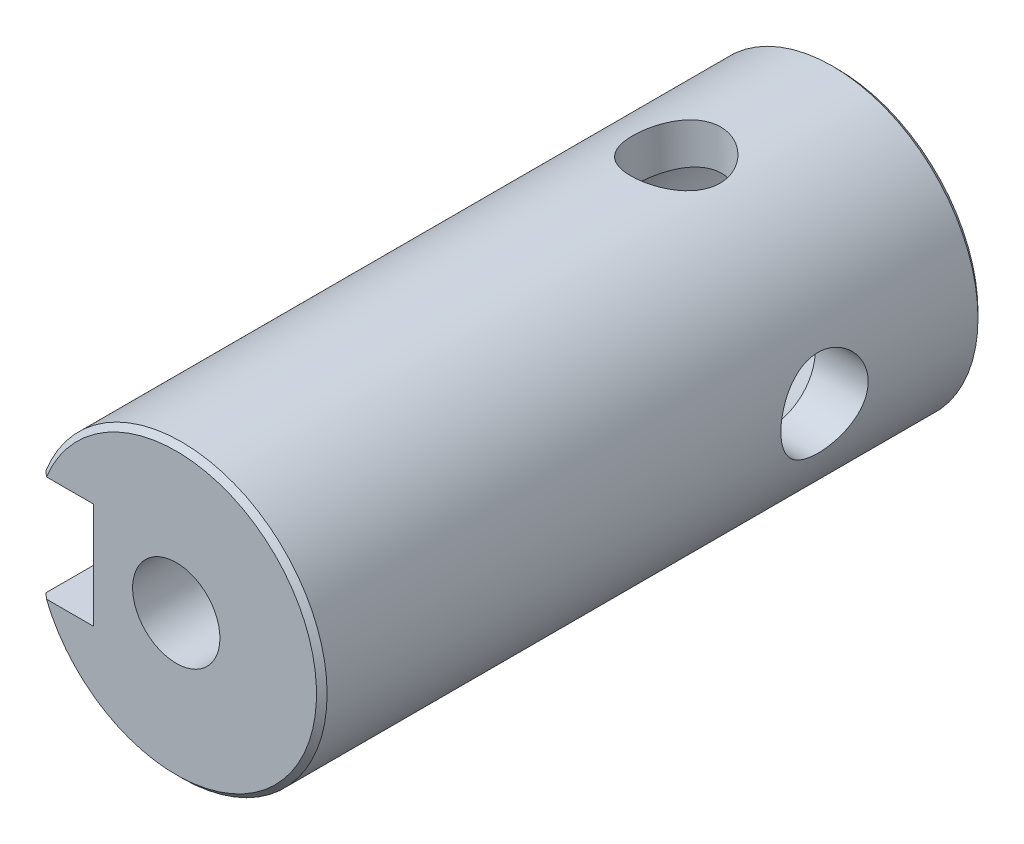
ISO-10303-21;
HEADER;
FILE_DESCRIPTION(('STEP AP214'),'2;1');
FILE_NAME('part.step','',(''),(''),'','','');
FILE_SCHEMA(('AUTOMOTIVE_DESIGN { 1 0 10303 214 1 1 1 1 }'));
ENDSEC;
DATA;
#1=APPLICATION_CONTEXT('core data for automotive mechanical design processes');
#2=APPLICATION_PROTOCOL_DEFINITION('international standard','automotive_design',2000,#1);
#3=PRODUCT_CONTEXT('',#1,'mechanical');
#4=PRODUCT('Part','Part','',(#3));
#5=PRODUCT_RELATED_PRODUCT_CATEGORY('part','',(#4));
#6=PRODUCT_DEFINITION_FORMATION('','',#4);
#7=PRODUCT_DEFINITION_CONTEXT('part definition',#1,'design');
#8=PRODUCT_DEFINITION('design','',#6,#7);
#9=PRODUCT_DEFINITION_SHAPE('','',#8);
#10=(LENGTH_UNIT() NAMED_UNIT(*) SI_UNIT(.MILLI.,.METRE.));
#11=(NAMED_UNIT(*) PLANE_ANGLE_UNIT() SI_UNIT($,.RADIAN.));
#12=(NAMED_UNIT(*) SI_UNIT($,.STERADIAN.) SOLID_ANGLE_UNIT());
#13=UNCERTAINTY_MEASURE_WITH_UNIT(LENGTH_MEASURE(1.E-05),#10,'distance_accuracy_value','');
#14=(GEOMETRIC_REPRESENTATION_CONTEXT(3) GLOBAL_UNCERTAINTY_ASSIGNED_CONTEXT((#13)) GLOBAL_UNIT_ASSIGNED_CONTEXT((#10,
#11,#12)) REPRESENTATION_CONTEXT('',''));
#15=CARTESIAN_POINT('',(0.,0.,0.));
#16=DIRECTION('',(0.,0.,1.));
#17=DIRECTION('',(1.,0.,0.));
#18=AXIS2_PLACEMENT_3D('',#15,#16,#17);
#19=CARTESIAN_POINT('',(0.,0.,18.));
#20=DIRECTION('',(0.,0.,-1.));
#21=DIRECTION('',(-1.,0.,0.));
#22=AXIS2_PLACEMENT_3D('',#19,#20,#21);
#23=CYLINDRICAL_SURFACE('',#22,5.5);
#24=CARTESIAN_POINT('',(0.,0.,0.200000000000009));
#25=DIRECTION('',(0.,0.,1.));
#26=DIRECTION('',(1.,0.,0.));
#27=AXIS2_PLACEMENT_3D('',#24,#25,#26);
#28=CIRCLE('',#27,5.5);
#29=CARTESIAN_POINT('',(5.5,0.,0.200000000000009));
#30=VERTEX_POINT('',#29);
#31=EDGE_CURVE('E46',#30,#30,#28,.T.);
#32=ORIENTED_EDGE('',*,*,#31,.T.);
#33=EDGE_LOOP('',(#32));
#34=FACE_BOUND('',#33,.T.);
#35=CARTESIAN_POINT('',(1.50153155011518,5.29106822900714,5.95280912227448));
#36=CARTESIAN_POINT('',(1.5015303981862,5.29106913211607,6.04322312501113));
#37=CARTESIAN_POINT('',(1.49401113626095,5.29321989611018,6.13364826883291));
#38=CARTESIAN_POINT('',(1.46421606809341,5.3015378549086,6.31185489682562));
#39=CARTESIAN_POINT('',(1.44193533127289,5.30770639170426,6.3996354874261));
#40=CARTESIAN_POINT('',(1.38345842765076,5.32324606494998,6.56994732337338));
#41=CARTESIAN_POINT('',(1.34728540528512,5.33261187190529,6.65248703487087));
#42=CARTESIAN_POINT('',(1.26215112112486,5.35339959233545,6.81039324966931));
#43=CARTESIAN_POINT('',(1.21318794491793,5.36482181353191,6.88575867682736));
#44=CARTESIAN_POINT('',(1.10223401079622,5.38872752084072,7.02956215190959));
#45=CARTESIAN_POINT('',(1.03990996759752,5.40123204592905,7.09773961001539));
#46=CARTESIAN_POINT('',(0.904757019184244,5.42550662780297,7.22291086872924));
#47=CARTESIAN_POINT('',(0.831926765739986,5.43727659004624,7.27990323176935));
#48=CARTESIAN_POINT('',(0.675998799726707,5.45887698226578,7.38221809209112));
#49=CARTESIAN_POINT('',(0.592719906020857,5.46866227020021,7.42727488916156));
#50=CARTESIAN_POINT('',(0.419434755560962,5.48467251645712,7.50269510722151));
#51=CARTESIAN_POINT('',(0.329429954530511,5.49089824268531,7.53306169711767));
#52=CARTESIAN_POINT('',(0.147999924659978,5.49873631768309,7.57737712347404));
#53=CARTESIAN_POINT('',(0.0566889822959188,5.50047554381514,7.59177076269244));
#54=CARTESIAN_POINT('',(-0.127017340836735,5.49929963229449,7.60513817938556));
#55=CARTESIAN_POINT('',(-0.219412489757571,5.49638547234987,7.60411519561664));
#56=CARTESIAN_POINT('',(-0.399548372267914,5.48618687771373,7.58697696687715));
#57=CARTESIAN_POINT('',(-0.487343624441412,5.47904458071596,7.57134340908362));
#58=CARTESIAN_POINT('',(-0.658893606341105,5.46107151611894,7.52621465268075));
#59=CARTESIAN_POINT('',(-0.742648079817531,5.45024051494716,7.49671857623754));
#60=CARTESIAN_POINT('',(-0.904898027978367,5.42567750963342,7.42437589651407));
#61=CARTESIAN_POINT('',(-0.983320888633931,5.41191318641183,7.38137779918648));
#62=CARTESIAN_POINT('',(-1.13193904345364,5.38279271160492,7.28337148460342));
#63=CARTESIAN_POINT('',(-1.20213237959169,5.367436182822,7.22836041801465));
#64=CARTESIAN_POINT('',(-1.33518482580393,5.33592910569586,7.10539159644772));
#65=CARTESIAN_POINT('',(-1.39765690545742,5.31977076870884,7.03701651134176));
#66=CARTESIAN_POINT('',(-1.51038625193318,5.28887122719429,6.89054810259542));
#67=CARTESIAN_POINT('',(-1.56064230487864,5.27413016358565,6.81245381434633));
#68=CARTESIAN_POINT('',(-1.64794544334277,5.24751253284465,6.64774570610059));
#69=CARTESIAN_POINT('',(-1.68486124471273,5.2356647893202,6.56105737182527));
#70=CARTESIAN_POINT('',(-1.74357018334511,5.21640954867743,6.38224119298438));
#71=CARTESIAN_POINT('',(-1.76536825401976,5.20900060314103,6.29011513358647));
#72=CARTESIAN_POINT('',(-1.79252481308124,5.19971675835682,6.10671852546128));
#73=CARTESIAN_POINT('',(-1.79846576587337,5.19764588322179,6.0155440759911));
#74=CARTESIAN_POINT('',(-1.79537069372692,5.19871595645134,5.83348893226363));
#75=CARTESIAN_POINT('',(-1.78633676528489,5.20185617525824,5.74260819867055));
#76=CARTESIAN_POINT('',(-1.75405977984982,5.21282543029024,5.56617190650653));
#77=CARTESIAN_POINT('',(-1.73119195409551,5.22053053794961,5.48053934158461));
#78=CARTESIAN_POINT('',(-1.67231504090381,5.23968648383901,5.31436726237808));
#79=CARTESIAN_POINT('',(-1.63630392444159,5.25113790038552,5.23382853671986));
#80=CARTESIAN_POINT('',(-1.55103327882956,5.2769617639337,5.07773991179514));
#81=CARTESIAN_POINT('',(-1.50144410706139,5.29140436136848,5.00238192919012));
#82=CARTESIAN_POINT('',(-1.39078387057753,5.32156022554797,4.86090720547561));
#83=CARTESIAN_POINT('',(-1.32971005763887,5.33727379591685,4.79479268290042));
#84=CARTESIAN_POINT('',(-1.19503680379969,5.36906354036306,4.67111067587828));
#85=CARTESIAN_POINT('',(-1.1210516298994,5.38513101776213,4.61395993038881));
#86=CARTESIAN_POINT('',(-0.964158466760682,5.41541984109964,4.51294575114397));
#87=CARTESIAN_POINT('',(-0.88125092092383,5.42964127870051,4.46908165751488));
#88=CARTESIAN_POINT('',(-0.709386344644363,5.45474541285029,4.39630908864936));
#89=CARTESIAN_POINT('',(-0.620480375804755,5.46565278909883,4.36728890449962));
#90=CARTESIAN_POINT('',(-0.438639572801134,5.48324053135257,4.32474211149503));
#91=CARTESIAN_POINT('',(-0.345705899250832,5.48992210651414,4.31121106973123));
#92=CARTESIAN_POINT('',(-0.162285747744116,5.49834240927421,4.30036377381454));
#93=CARTESIAN_POINT('',(-0.0718428500683995,5.5002615763426,4.30244315732588));
#94=CARTESIAN_POINT('',(0.107472422809604,5.49968072049759,4.32131291802353));
#95=CARTESIAN_POINT('',(0.196344886768354,5.49718094814215,4.33810246110298));
#96=CARTESIAN_POINT('',(0.369055446982194,5.48827867610217,4.38554194981408));
#97=CARTESIAN_POINT('',(0.452937356088067,5.48191837368101,4.41604112098841));
#98=CARTESIAN_POINT('',(0.614523055341332,5.46616494139375,4.4898992282324));
#99=CARTESIAN_POINT('',(0.692225827555185,5.4567713131107,4.5332602775893));
#100=CARTESIAN_POINT('',(0.841926540171421,5.43572071142116,4.63321992544753));
#101=CARTESIAN_POINT('',(0.913662387435108,5.42400093457887,4.69019769527534));
#102=CARTESIAN_POINT('',(1.04677646795459,5.39989298118411,4.81509054944057));
#103=CARTESIAN_POINT('',(1.10815170753376,5.38750461280342,4.88300878396246));
#104=CARTESIAN_POINT('',(1.22060785369356,5.36316430506256,5.03028397841604));
#105=CARTESIAN_POINT('',(1.27132742365792,5.35123637785965,5.10992153100397));
#106=CARTESIAN_POINT('',(1.35853197460767,5.32976729954222,5.27691981385161));
#107=CARTESIAN_POINT('',(1.39502379542825,5.32022500235566,5.3642768082358));
#108=CARTESIAN_POINT('',(1.44942152788643,5.30564630392697,5.53452359704139));
#109=CARTESIAN_POINT('',(1.46890779971119,5.30023485905886,5.61687863389858));
#110=CARTESIAN_POINT('',(1.49496205443431,5.29294575363555,5.78375586701984));
#111=CARTESIAN_POINT('',(1.50153262709749,5.29106738465618,5.86827762538426));
#112=CARTESIAN_POINT('',(1.50153155011518,5.29106822900714,5.95280912227448));
#113=B_SPLINE_CURVE_WITH_KNOTS('',3,(#35,#36,#37,#38,#39,#40,#41,#42,#43,#44,#45,#46,#47,#48,
#49,#50,#51,#52,#53,#54,#55,#56,#57,#58,#59,#60,#61,#62,#63,#64,#65,#66,#67,#68,#69,#70,#71,#72,
#73,#74,#75,#76,#77,#78,#79,#80,#81,#82,#83,#84,#85,#86,#87,#88,#89,#90,#91,#92,#93,#94,#95,#96,
#97,#98,#99,#100,#101,#102,#103,#104,#105,#106,#107,#108,#109,#110,#111,#112),.UNSPECIFIED.,.T.,
.F.,(4,2,2,2,2,2,2,2,2,2,2,2,2,2,2,2,2,2,2,2,2,2,2,2,2,2,2,2,2,2,2,2,2,2,2,2,2,2,4),(0.,
0.270930182507096,0.541950905857897,0.812522055912808,1.08313372790711,1.36150465008782,
1.63991132658399,1.92407533201008,2.20817801146663,2.48415354164512,2.76007109511583,
3.02720138589967,3.29434859479412,3.56460730269242,3.83493018249911,4.11567361725603,
4.39644493741047,4.6799086207089,4.9632797569125,5.23608888869337,5.50885983018123,
5.77454454432695,6.04027029150363,6.31312804990324,6.58605118521811,6.86927456710659,
7.15248388056618,7.43352930995753,7.71449428553846,7.98463934302338,8.25476908352526,
8.52199806559436,8.78927097940511,9.06509589759932,9.34100037892874,9.62512803636057,
9.90911893360333,10.1624726924319,10.4157756453691),.UNSPECIFIED.);
#114=CARTESIAN_POINT('',(1.50153155011518,5.29106822900714,5.95280912227448));
#115=VERTEX_POINT('',#114);
#116=EDGE_CURVE('E388',#115,#115,#113,.T.);
#117=ORIENTED_EDGE('',*,*,#116,.T.);
#118=EDGE_LOOP('',(#117));
#119=FACE_BOUND('',#118,.T.);
#120=CARTESIAN_POINT('',(5.5,0.,7.64999999999999));
#121=CARTESIAN_POINT('',(5.49999922175605,0.0905174740286296,7.64999890276662));
#122=CARTESIAN_POINT('',(5.49774407263349,0.181046050186682,7.64252675001363));
#123=CARTESIAN_POINT('',(5.4889681615306,0.359466937835367,7.61290651035568));
#124=CARTESIAN_POINT('',(5.48244612728661,0.44735845485256,7.59075404617432));
#125=CARTESIAN_POINT('',(5.4658510775202,0.617905978529977,7.5325793813987));
#126=CARTESIAN_POINT('',(5.45578330275468,0.700569500834907,7.49657764341916));
#127=CARTESIAN_POINT('',(5.4331432016141,0.858686599158441,7.41181029763858));
#128=CARTESIAN_POINT('',(5.42057054211273,0.934139214216633,7.36304299186504));
#129=CARTESIAN_POINT('',(5.39385810912051,1.07785897690212,7.25265359178006));
#130=CARTESIAN_POINT('',(5.3796862202274,1.14588987836877,7.19073171152549));
#131=CARTESIAN_POINT('',(5.35156417631486,1.27077413015656,7.05642984709879));
#132=CARTESIAN_POINT('',(5.33761405896952,1.32762559960184,6.98404810666254));
#133=CARTESIAN_POINT('',(5.31117525393149,1.42978041496078,6.82888217165862));
#134=CARTESIAN_POINT('',(5.29872647330262,1.47479539924434,6.74590069291019));
#135=CARTESIAN_POINT('',(5.27717982433434,1.55013534252236,6.57311182034668));
#136=CARTESIAN_POINT('',(5.26808115144642,1.5804638291197,6.48330607167923));
#137=CARTESIAN_POINT('',(5.25459957922278,1.62471797050916,6.30207070725649));
#138=CARTESIAN_POINT('',(5.25009176256987,1.63907915858145,6.21075698174966));
#139=CARTESIAN_POINT('',(5.24593068724744,1.65235103676139,6.02691352816156));
#140=CARTESIAN_POINT('',(5.24627625236629,1.65126547037186,5.934384100135));
#141=CARTESIAN_POINT('',(5.25167218474556,1.63401674919792,5.75427770053067));
#142=CARTESIAN_POINT('',(5.25655227459055,1.61839925788953,5.66664252460154));
#143=CARTESIAN_POINT('',(5.27019191851487,1.57341162469761,5.4952982350992));
#144=CARTESIAN_POINT('',(5.27895185545586,1.54404012555804,5.41158950988824));
#145=CARTESIAN_POINT('',(5.2995000638247,1.47197629319049,5.24913961537319));
#146=CARTESIAN_POINT('',(5.31132817727547,1.42910698628106,5.17048220764921));
#147=CARTESIAN_POINT('',(5.33666085700071,1.33138744847551,5.02129477578879));
#148=CARTESIAN_POINT('',(5.3501658292169,1.27653431402847,4.95076672764485));
#149=CARTESIAN_POINT('',(5.37802112427731,1.153694198421,4.81674519016178));
#150=CARTESIAN_POINT('',(5.39238319741548,1.08525439821366,4.75366846956737));
#151=CARTESIAN_POINT('',(5.41983468469584,0.93858958524536,4.63979061752933));
#152=CARTESIAN_POINT('',(5.43292401870251,0.860363957046973,4.58899025874414));
#153=CARTESIAN_POINT('',(5.45647476076417,0.695590542177081,4.5008540852888));
#154=CARTESIAN_POINT('',(5.46691798035145,0.608990524722743,4.46361073212516));
#155=CARTESIAN_POINT('',(5.48386874015444,0.43036995716387,4.40434045089041));
#156=CARTESIAN_POINT('',(5.49037737805699,0.338350926748539,4.38230927861427));
#157=CARTESIAN_POINT('',(5.49855201107892,0.155047466935164,4.35478260431067));
#158=CARTESIAN_POINT('',(5.50038335459569,0.0638551073613059,4.34872225561824));
#159=CARTESIAN_POINT('',(5.49948215565936,-0.11824956640572,4.3517260712833));
#160=CARTESIAN_POINT('',(5.49675022245532,-0.209161916359858,4.36078821661659));
#161=CARTESIAN_POINT('',(5.48713766685879,-0.385993965840665,4.39332307222265));
#162=CARTESIAN_POINT('',(5.48035212779358,-0.471980049875584,4.41646572633896));
#163=CARTESIAN_POINT('',(5.46341782625686,-0.638830102849971,4.47610755605603));
#164=CARTESIAN_POINT('',(5.45326865953193,-0.719693454728139,4.51260833714165));
#165=CARTESIAN_POINT('',(5.43036619786457,-0.876080908407154,4.59887848202925));
#166=CARTESIAN_POINT('',(5.41755808912642,-0.951438208819632,4.64893527504277));
#167=CARTESIAN_POINT('',(5.39080815640749,-1.09287563877816,4.7605472294581));
#168=CARTESIAN_POINT('',(5.37686604874188,-1.15895343559152,4.82210527307644));
#169=CARTESIAN_POINT('',(5.34878489056052,-1.28244319006129,4.95762603920628));
#170=CARTESIAN_POINT('',(5.33465707536594,-1.33945329354653,5.03195806334891));
#171=CARTESIAN_POINT('',(5.3083416676231,-1.44021894579368,5.18944073291489));
#172=CARTESIAN_POINT('',(5.29615402420117,-1.48397484212419,5.27259114701404));
#173=CARTESIAN_POINT('',(5.27523908576561,-1.55669081839885,5.44508574038016));
#174=CARTESIAN_POINT('',(5.2664957162821,-1.58571981630754,5.53439880519025));
#175=CARTESIAN_POINT('',(5.25350753799074,-1.62823903896625,5.71695676582463));
#176=CARTESIAN_POINT('',(5.2492611875913,-1.64173458876656,5.81020030286644));
#177=CARTESIAN_POINT('',(5.24589969745696,-1.65244182933564,5.99379767021385));
#178=CARTESIAN_POINT('',(5.2465781218703,-1.65030860839338,6.08411001611934));
#179=CARTESIAN_POINT('',(5.25249341417124,-1.63138255989294,6.26302551371008));
#180=CARTESIAN_POINT('',(5.25773009951806,-1.61459031937187,6.35162873369399));
#181=CARTESIAN_POINT('',(5.27203340037424,-1.56724577684549,6.52353993905713));
#182=CARTESIAN_POINT('',(5.28105165000561,-1.53686693057775,6.60690001609786));
#183=CARTESIAN_POINT('',(5.3018930680005,-1.46334657833242,6.76740668269949));
#184=CARTESIAN_POINT('',(5.31371677313743,-1.42020262959163,6.84455207940483));
#185=CARTESIAN_POINT('',(5.33937444068416,-1.32053640185579,6.99347942817982));
#186=CARTESIAN_POINT('',(5.35326594180177,-1.26358403702293,7.06496363738645));
#187=CARTESIAN_POINT('',(5.38121452495028,-1.1386917809276,7.19757274813865));
#188=CARTESIAN_POINT('',(5.39527164906296,-1.07074903884795,7.25869495341453));
#189=CARTESIAN_POINT('',(5.42246030227714,-0.92341233840157,7.37062575352453));
#190=CARTESIAN_POINT('',(5.43555275742241,-0.843741674369666,7.42108059154103));
#191=CARTESIAN_POINT('',(5.45886748501394,-0.676655511381881,7.50780868689442));
#192=CARTESIAN_POINT('',(5.46909109924173,-0.589243658298849,7.54408857710195));
#193=CARTESIAN_POINT('',(5.48462392466231,-0.418833483920808,7.59818480321802));
#194=CARTESIAN_POINT('',(5.49034230119174,-0.336365658149656,7.61756284017157));
#195=CARTESIAN_POINT('',(5.49803038943942,-0.169268214753857,7.64346987776573));
#196=CARTESIAN_POINT('',(5.50000072770214,-0.0846389608439533,7.65000102597529));
#197=CARTESIAN_POINT('',(5.5,0.,7.64999999999999));
#198=B_SPLINE_CURVE_WITH_KNOTS('',3,(#120,#121,#122,#123,#124,#125,#126,#127,#128,#129,#130,
#131,#132,#133,#134,#135,#136,#137,#138,#139,#140,#141,#142,#143,#144,#145,#146,#147,#148,#149,
#150,#151,#152,#153,#154,#155,#156,#157,#158,#159,#160,#161,#162,#163,#164,#165,#166,#167,#168,
#169,#170,#171,#172,#173,#174,#175,#176,#177,#178,#179,#180,#181,#182,#183,#184,#185,#186,#187,
#188,#189,#190,#191,#192,#193,#194,#195,#196,#197),.UNSPECIFIED.,.T.,.F.,(4,2,2,2,2,2,2,2,2,2,2,
2,2,2,2,2,2,2,2,2,2,2,2,2,2,2,2,2,2,2,2,2,2,2,2,2,2,2,4),(0.,0.271241523973871,
0.542563961330597,0.813487043930958,1.08444618085397,1.3624116324301,1.64042381017496,
1.92468629104519,2.20888045997545,2.48511658292258,2.76128576150997,3.02748618367442,
3.293712880238,3.5635866909183,3.83352596174409,4.11473814452982,4.39596802184177,
4.67908151569856,4.96211598881686,5.23499690382397,5.50784138905357,5.77452421350557,
6.04123910053099,6.31412436273196,6.58707810200208,6.86994440355098,7.15280328677946,
7.43432596446374,7.71575210406308,7.98545171013634,8.25514051627757,8.5214804444299,
8.78787137308414,9.0639661824792,9.34013272387249,9.62437295772334,9.90848002754755,
10.162148611235,10.4157747864376),.UNSPECIFIED.);
#199=CARTESIAN_POINT('',(5.5,0.,7.64999999999999));
#200=VERTEX_POINT('',#199);
#201=EDGE_CURVE('E125',#200,#200,#198,.T.);
#202=ORIENTED_EDGE('',*,*,#201,.T.);
#203=EDGE_LOOP('',(#202));
#204=FACE_BOUND('',#203,.T.);
#205=DIRECTION('',(0.,0.,-1.));
#206=VECTOR('',#205,1.);
#207=CARTESIAN_POINT('',(-5.1234753829798,2.,18.));
#208=LINE('',#207,#206);
#209=CARTESIAN_POINT('',(-5.1234753829798,2.,17.));
#210=VERTEX_POINT('',#209);
#211=CARTESIAN_POINT('',(-5.1234753829798,2.,24.8));
#212=VERTEX_POINT('',#211);
#213=EDGE_CURVE('E140',#210,#212,#208,.F.);
#214=ORIENTED_EDGE('',*,*,#213,.T.);
#215=CARTESIAN_POINT('',(0.,0.,24.8));
#216=DIRECTION('',(0.,0.,1.));
#217=DIRECTION('',(1.,0.,0.));
#218=AXIS2_PLACEMENT_3D('',#215,#216,#217);
#219=CIRCLE('',#218,5.5);
#220=CARTESIAN_POINT('',(-5.1234753829798,-2.,24.8));
#221=VERTEX_POINT('',#220);
#222=EDGE_CURVE('E53',#212,#221,#219,.F.);
#223=ORIENTED_EDGE('',*,*,#222,.T.);
#224=DIRECTION('',(0.,0.,-1.));
#225=VECTOR('',#224,1.);
#226=CARTESIAN_POINT('',(-5.1234753829798,-2.,18.));
#227=LINE('',#226,#225);
#228=CARTESIAN_POINT('',(-5.1234753829798,-2.,17.));
#229=VERTEX_POINT('',#228);
#230=EDGE_CURVE('E137',#221,#229,#227,.T.);
#231=ORIENTED_EDGE('',*,*,#230,.T.);
#232=CARTESIAN_POINT('',(0.,0.,17.));
#233=DIRECTION('',(0.,0.,1.));
#234=DIRECTION('',(1.,0.,0.));
#235=AXIS2_PLACEMENT_3D('',#232,#233,#234);
#236=CIRCLE('',#235,5.5);
#237=EDGE_CURVE('E105',#210,#229,#236,.T.);
#238=ORIENTED_EDGE('',*,*,#237,.F.);
#239=EDGE_LOOP('',(#214,#223,#231,#238));
#240=FACE_BOUND('',#239,.T.);
#241=ADVANCED_FACE('F38',(#34,#119,#204,#240),#23,.T.);
#242=CARTESIAN_POINT('',(0.,0.,0.));
#243=DIRECTION('',(0.,0.,1.));
#244=DIRECTION('',(1.,0.,0.));
#245=AXIS2_PLACEMENT_3D('',#242,#243,#244);
#246=PLANE('',#245);
#247=CARTESIAN_POINT('',(0.,0.,0.));
#248=DIRECTION('',(0.,0.,1.));
#249=DIRECTION('',(1.,0.,0.));
#250=AXIS2_PLACEMENT_3D('',#247,#248,#249);
#251=CIRCLE('',#250,5.29999999999999);
#252=CARTESIAN_POINT('',(5.29999999999999,0.,0.));
#253=VERTEX_POINT('',#252);
#254=EDGE_CURVE('E11',#253,#253,#251,.F.);
#255=ORIENTED_EDGE('',*,*,#254,.T.);
#256=EDGE_LOOP('',(#255));
#257=FACE_BOUND('',#256,.T.);
#258=DIRECTION('',(0.,1.,0.));
#259=VECTOR('',#258,1.);
#260=CARTESIAN_POINT('',(3.5,0.,0.));
#261=LINE('',#260,#259);
#262=CARTESIAN_POINT('',(3.5,-1.93649167310371,0.));
#263=VERTEX_POINT('',#262);
#264=CARTESIAN_POINT('',(3.5,1.93649167310371,0.));
#265=VERTEX_POINT('',#264);
#266=EDGE_CURVE('E151',#263,#265,#261,.T.);
#267=ORIENTED_EDGE('',*,*,#266,.T.);
#268=CARTESIAN_POINT('',(0.,0.,0.));
#269=DIRECTION('',(0.,0.,-1.));
#270=DIRECTION('',(-1.,0.,0.));
#271=AXIS2_PLACEMENT_3D('',#268,#269,#270);
#272=CIRCLE('',#271,4.);
#273=EDGE_CURVE('E154',#263,#265,#272,.T.);
#274=ORIENTED_EDGE('',*,*,#273,.F.);
#275=EDGE_LOOP('',(#267,#274));
#276=FACE_BOUND('',#275,.T.);
#277=ADVANCED_FACE('F209',(#257,#276),#246,.F.);
#278=CARTESIAN_POINT('',(0.,0.,18.));
#279=DIRECTION('',(0.,0.,-1.));
#280=DIRECTION('',(-1.,0.,0.));
#281=AXIS2_PLACEMENT_3D('',#278,#279,#280);
#282=CYLINDRICAL_SURFACE('',#281,4.);
#283=CARTESIAN_POINT('',(-0.112691389733023,3.99841226622268,4.3028091222745));
#284=CARTESIAN_POINT('',(-0.201115761047302,3.99591320611046,4.30281833948113));
#285=CARTESIAN_POINT('',(-0.289599727577964,3.99045655464463,4.30996513661781));
#286=CARTESIAN_POINT('',(-0.463902114811283,3.97397909373033,4.33830026421139));
#287=CARTESIAN_POINT('',(-0.54971287757085,3.96294362550712,4.35952563329881));
#288=CARTESIAN_POINT('',(-0.715883818317381,3.93631362423079,4.41510393447639));
#289=CARTESIAN_POINT('',(-0.796261250638414,3.92073444787956,4.44941276562795));
#290=CARTESIAN_POINT('',(-0.949943605929999,3.88636287398673,4.53000388012392));
#291=CARTESIAN_POINT('',(-1.02325073997387,3.86757148612037,4.57628240344465));
#292=CARTESIAN_POINT('',(-1.16448097008582,3.82748151083153,4.68191587691854));
#293=CARTESIAN_POINT('',(-1.23201166729829,3.80610803870709,4.74176679252346));
#294=CARTESIAN_POINT('',(-1.35640476878568,3.76357493762523,4.87179796193346));
#295=CARTESIAN_POINT('',(-1.4132616588742,3.74241542451205,4.9419835214863));
#296=CARTESIAN_POINT('',(-1.51743081541222,3.70144439708106,5.0947773711462));
#297=CARTESIAN_POINT('',(-1.56415396067866,3.68174633393808,5.17782023758101));
#298=CARTESIAN_POINT('',(-1.64292006937118,3.64728335318826,5.35154543156467));
#299=CARTESIAN_POINT('',(-1.67497044644255,3.63251594531406,5.4422238736375));
#300=CARTESIAN_POINT('',(-1.7219384196934,3.6104814311589,5.62415711927632));
#301=CARTESIAN_POINT('',(-1.73759713826639,3.60289154010408,5.71518019441756));
#302=CARTESIAN_POINT('',(-1.75366942720933,3.59509830148741,5.89885562963976));
#303=CARTESIAN_POINT('',(-1.75409116773975,3.5948909953394,5.99150708990379));
#304=CARTESIAN_POINT('',(-1.7402362755557,3.6016135755887,6.16840800889321));
#305=CARTESIAN_POINT('',(-1.72705743859821,3.60801041168419,6.25276728102364));
#306=CARTESIAN_POINT('',(-1.6881996449483,3.62635335241089,6.41791940665565));
#307=CARTESIAN_POINT('',(-1.66251834977322,3.63830049516249,6.49871158987778));
#308=CARTESIAN_POINT('',(-1.59886087076853,3.66672556744404,6.6564542310331));
#309=CARTESIAN_POINT('',(-1.56063700925551,3.68329366592276,6.73328786008281));
#310=CARTESIAN_POINT('',(-1.47311852517527,3.71916047808678,6.87966935473452));
#311=CARTESIAN_POINT('',(-1.42381958679883,3.73846025518306,6.94921436452363));
#312=CARTESIAN_POINT('',(-1.31072348054093,3.77967088910092,7.08509553006229));
#313=CARTESIAN_POINT('',(-1.24606465347709,3.80166570142357,7.15069107997773));
#314=CARTESIAN_POINT('',(-1.10643573373414,3.84462372068794,7.27025379671585));
#315=CARTESIAN_POINT('',(-1.03146332632554,3.86558669461077,7.32421834613532));
#316=CARTESIAN_POINT('',(-0.871093952925009,3.90488810636736,7.42004389585951));
#317=CARTESIAN_POINT('',(-0.785502415225924,3.92315790004321,7.46160940546865));
#318=CARTESIAN_POINT('',(-0.607582205110208,3.95461559658807,7.52941214638335));
#319=CARTESIAN_POINT('',(-0.515257210293992,3.96780624916395,7.55565767548564));
#320=CARTESIAN_POINT('',(-0.33264230561977,3.987135652941,7.59053862595269));
#321=CARTESIAN_POINT('',(-0.242583296672018,3.99366216733572,7.60016830021041));
#322=CARTESIAN_POINT('',(-0.0618837821847617,4.00054197081742,7.60450116603777));
#323=CARTESIAN_POINT('',(0.0287565535125477,4.00089698752991,7.59920853538269));
#324=CARTESIAN_POINT('',(0.203417284228009,3.99573435555268,7.57456385403152));
#325=CARTESIAN_POINT('',(0.28754569899561,3.99050026100919,7.55590504893438));
#326=CARTESIAN_POINT('',(0.451524529309578,3.9752875342807,7.50601702593737));
#327=CARTESIAN_POINT('',(0.531374400385998,3.96530829983661,7.47478621245968));
#328=CARTESIAN_POINT('',(0.687296443779478,3.94132483032678,7.39961974229358));
#329=CARTESIAN_POINT('',(0.763175024706073,3.92720550905377,7.35532056051826));
#330=CARTESIAN_POINT('',(0.906761195338253,3.89656040183148,7.25567518801661));
#331=CARTESIAN_POINT('',(0.9744653860799,3.88003362110434,7.20032442718464));
#332=CARTESIAN_POINT('',(1.10473236661442,3.84505264485455,7.0756048174625));
#333=CARTESIAN_POINT('',(1.16660205318265,3.82654455010611,7.00552529823518));
#334=CARTESIAN_POINT('',(1.27785668488536,3.79084486394191,6.85573783166595));
#335=CARTESIAN_POINT('',(1.32723900143875,3.77365355023749,6.77602786233192));
#336=CARTESIAN_POINT('',(1.41254471299283,3.74256796048142,6.60771375174116));
#337=CARTESIAN_POINT('',(1.44828425371815,3.72871958907438,6.51900720626642));
#338=CARTESIAN_POINT('',(1.5038660656105,3.70665588659632,6.33609995629623));
#339=CARTESIAN_POINT('',(1.52372109342264,3.69843603609963,6.2419037258563));
#340=CARTESIAN_POINT('',(1.54568650793002,3.68930639291367,6.05837884911641));
#341=CARTESIAN_POINT('',(1.54902698957873,3.68789008377589,5.96922190281654));
#342=CARTESIAN_POINT('',(1.54113510508126,3.69119510536539,5.7916806515153));
#343=CARTESIAN_POINT('',(1.52990487145076,3.69591553794217,5.70329623535511));
#344=CARTESIAN_POINT('',(1.49422966005666,3.71047441982158,5.53387605101678));
#345=CARTESIAN_POINT('',(1.4703981422157,3.72007453652824,5.45268841085237));
#346=CARTESIAN_POINT('',(1.41081287093726,3.74307648007525,5.2953945998004));
#347=CARTESIAN_POINT('',(1.37505578140346,3.75647937055851,5.21928985797687));
#348=CARTESIAN_POINT('',(1.29021665609666,3.78648614894867,5.06938708403309));
#349=CARTESIAN_POINT('',(1.24046891792629,3.80323295046508,4.99599505125308));
#350=CARTESIAN_POINT('',(1.13005275406373,3.83748867779731,4.85813743501021));
#351=CARTESIAN_POINT('',(1.06938066417582,3.85499785782805,4.79367485950007));
#352=CARTESIAN_POINT('',(0.933781345940147,3.89015313140849,4.67081498357081));
#353=CARTESIAN_POINT('',(0.858149105556299,3.90772120265453,4.61316989866896));
#354=CARTESIAN_POINT('',(0.697632252800852,3.93954229216958,4.51126896273577));
#355=CARTESIAN_POINT('',(0.612743432478444,3.95379379345434,4.46701923590859));
#356=CARTESIAN_POINT('',(0.43754608121075,3.97696242232449,4.39414538243975));
#357=CARTESIAN_POINT('',(0.3473552267437,3.98596670351892,4.36526669691594));
#358=CARTESIAN_POINT('',(0.163156615970635,3.99772780607177,4.32329803748935));
#359=CARTESIAN_POINT('',(0.0691618226961332,4.00050428091806,4.31015845602905));
#360=CARTESIAN_POINT('',(-0.0542613325219783,3.99974088095001,4.30358235194445));
#361=CARTESIAN_POINT('',(-0.0834731076575579,3.9992380367902,4.30280607661028));
#362=CARTESIAN_POINT('',(-0.112691389733023,3.99841226622268,4.3028091222745));
#363=B_SPLINE_CURVE_WITH_KNOTS('',3,(#283,#284,#285,#286,#287,#288,#289,#290,#291,#292,#293,
#294,#295,#296,#297,#298,#299,#300,#301,#302,#303,#304,#305,#306,#307,#308,#309,#310,#311,#312,
#313,#314,#315,#316,#317,#318,#319,#320,#321,#322,#323,#324,#325,#326,#327,#328,#329,#330,#331,
#332,#333,#334,#335,#336,#337,#338,#339,#340,#341,#342,#343,#344,#345,#346,#347,#348,#349,#350,
#351,#352,#353,#354,#355,#356,#357,#358,#359,#360,#361,#362),.UNSPECIFIED.,.T.,.F.,(4,2,2,2,2,2,
2,2,2,2,2,2,2,2,2,2,2,2,2,2,2,2,2,2,2,2,2,2,2,2,2,2,2,2,2,2,2,2,2,4),(0.,0.265297098770619,
0.531294937906657,0.796403981498876,1.06142984766522,1.33841878994456,1.61555043582128,
1.90598404924537,2.19627075414924,2.4727764853942,2.74913395037958,3.00480633611682,
3.26052656166859,3.52163539301339,3.78284615202013,4.06565185095454,4.34852112528507,
4.63767392136373,4.92666995726765,5.19768149557683,5.46861716672802,5.72643264660551,
5.98428085748381,6.25011488704503,6.51605907418429,6.80064580250399,7.08529238632155,
7.37364985225778,7.66177550895672,7.9280782322672,8.19434198489781,8.44869772098555,
8.70312467109941,8.97267479984705,9.24231550885209,9.53104085816537,9.81989801073174,
10.1038095613048,10.3868238858898,10.4744866574817),.UNSPECIFIED.);
#364=CARTESIAN_POINT('',(-0.112691389733023,3.99841226622268,4.3028091222745));
#365=VERTEX_POINT('',#364);
#366=EDGE_CURVE('E383',#365,#365,#363,.T.);
#367=ORIENTED_EDGE('',*,*,#366,.T.);
#368=EDGE_LOOP('',(#367));
#369=FACE_BOUND('',#368,.T.);
#370=DIRECTION('',(0.,0.,-1.));
#371=VECTOR('',#370,1.);
#372=CARTESIAN_POINT('',(3.5,1.93649167310371,18.));
#373=LINE('',#372,#371);
#374=CARTESIAN_POINT('',(3.5,1.93649167310371,16.));
#375=VERTEX_POINT('',#374);
#376=EDGE_CURVE('E158',#265,#375,#373,.F.);
#377=ORIENTED_EDGE('',*,*,#376,.T.);
#378=CARTESIAN_POINT('',(0.,0.,16.));
#379=DIRECTION('',(0.,0.,-1.));
#380=DIRECTION('',(-1.,0.,0.));
#381=AXIS2_PLACEMENT_3D('',#378,#379,#380);
#382=CIRCLE('',#381,4.);
#383=CARTESIAN_POINT('',(3.5,-1.93649167310371,16.));
#384=VERTEX_POINT('',#383);
#385=EDGE_CURVE('E148',#375,#384,#382,.F.);
#386=ORIENTED_EDGE('',*,*,#385,.T.);
#387=DIRECTION('',(0.,0.,-1.));
#388=VECTOR('',#387,1.);
#389=CARTESIAN_POINT('',(3.5,-1.93649167310371,18.));
#390=LINE('',#389,#388);
#391=EDGE_CURVE('E156',#384,#263,#390,.T.);
#392=ORIENTED_EDGE('',*,*,#391,.T.);
#393=ORIENTED_EDGE('',*,*,#273,.T.);
#394=EDGE_LOOP('',(#377,#386,#392,#393));
#395=FACE_BOUND('',#394,.T.);
#396=ADVANCED_FACE('F213',(#369,#395),#282,.F.);
#397=CARTESIAN_POINT('',(3.5,0.,18.));
#398=DIRECTION('',(-1.,0.,0.));
#399=DIRECTION('',(0.,0.,1.));
#400=AXIS2_PLACEMENT_3D('',#397,#398,#399);
#401=PLANE('',#400);
#402=CARTESIAN_POINT('',(3.5,0.,6.));
#403=DIRECTION('',(-1.,0.,0.));
#404=DIRECTION('',(0.,0.,1.));
#405=AXIS2_PLACEMENT_3D('',#402,#403,#404);
#406=CIRCLE('',#405,1.64999999999999);
#407=CARTESIAN_POINT('',(3.5,0.,7.64999999999999));
#408=VERTEX_POINT('',#407);
#409=EDGE_CURVE('E395',#408,#408,#406,.T.);
#410=ORIENTED_EDGE('',*,*,#409,.F.);
#411=EDGE_LOOP('',(#410));
#412=FACE_BOUND('',#411,.T.);
#413=DIRECTION('',(0.,-1.,0.));
#414=VECTOR('',#413,1.);
#415=CARTESIAN_POINT('',(3.5,0.,16.));
#416=LINE('',#415,#414);
#417=EDGE_CURVE('E161',#375,#384,#416,.T.);
#418=ORIENTED_EDGE('',*,*,#417,.F.);
#419=ORIENTED_EDGE('',*,*,#376,.F.);
#420=ORIENTED_EDGE('',*,*,#266,.F.);
#421=ORIENTED_EDGE('',*,*,#391,.F.);
#422=EDGE_LOOP('',(#418,#419,#420,#421));
#423=FACE_BOUND('',#422,.T.);
#424=ADVANCED_FACE('F219',(#412,#423),#401,.T.);
#425=CARTESIAN_POINT('',(0.,0.,25.));
#426=DIRECTION('',(0.,0.,1.));
#427=DIRECTION('',(1.,0.,0.));
#428=AXIS2_PLACEMENT_3D('',#425,#426,#427);
#429=PLANE('',#428);
#430=DIRECTION('',(1.,0.,0.));
#431=VECTOR('',#430,1.);
#432=CARTESIAN_POINT('',(0.,-2.,25.));
#433=LINE('',#432,#431);
#434=CARTESIAN_POINT('',(-4.90815647672321,-2.,25.));
#435=VERTEX_POINT('',#434);
#436=CARTESIAN_POINT('',(-3.12,-2.,25.));
#437=VERTEX_POINT('',#436);
#438=EDGE_CURVE('E114',#435,#437,#433,.T.);
#439=ORIENTED_EDGE('',*,*,#438,.F.);
#440=CARTESIAN_POINT('',(0.,0.,25.));
#441=DIRECTION('',(0.,0.,1.));
#442=DIRECTION('',(1.,0.,0.));
#443=AXIS2_PLACEMENT_3D('',#440,#441,#442);
#444=CIRCLE('',#443,5.3);
#445=CARTESIAN_POINT('',(-4.90815647672321,2.,25.));
#446=VERTEX_POINT('',#445);
#447=EDGE_CURVE('E166',#435,#446,#444,.T.);
#448=ORIENTED_EDGE('',*,*,#447,.T.);
#449=DIRECTION('',(-1.,0.,0.));
#450=VECTOR('',#449,1.);
#451=CARTESIAN_POINT('',(-3.5,2.,25.));
#452=LINE('',#451,#450);
#453=CARTESIAN_POINT('',(-3.12,2.,25.));
#454=VERTEX_POINT('',#453);
#455=EDGE_CURVE('E108',#454,#446,#452,.T.);
#456=ORIENTED_EDGE('',*,*,#455,.F.);
#457=DIRECTION('',(0.,1.,0.));
#458=VECTOR('',#457,1.);
#459=CARTESIAN_POINT('',(-3.12,-2.,25.));
#460=LINE('',#459,#458);
#461=EDGE_CURVE('E123',#437,#454,#460,.T.);
#462=ORIENTED_EDGE('',*,*,#461,.F.);
#463=EDGE_LOOP('',(#439,#448,#456,#462));
#464=FACE_BOUND('',#463,.T.);
#465=CARTESIAN_POINT('',(0.,0.,25.));
#466=DIRECTION('',(0.,0.,1.));
#467=DIRECTION('',(1.,0.,0.));
#468=AXIS2_PLACEMENT_3D('',#465,#466,#467);
#469=CIRCLE('',#468,1.64999999999999);
#470=CARTESIAN_POINT('',(1.64999999999999,0.,25.));
#471=VERTEX_POINT('',#470);
#472=EDGE_CURVE('E142',#471,#471,#469,.T.);
#473=ORIENTED_EDGE('',*,*,#472,.F.);
#474=EDGE_LOOP('',(#473));
#475=FACE_BOUND('',#474,.T.);
#476=ADVANCED_FACE('F223',(#464,#475),#429,.T.);
#477=CARTESIAN_POINT('',(0.,0.,16.));
#478=DIRECTION('',(0.,0.,-1.));
#479=DIRECTION('',(-1.,0.,0.));
#480=AXIS2_PLACEMENT_3D('',#477,#478,#479);
#481=PLANE('',#480);
#482=CARTESIAN_POINT('',(0.,0.,16.));
#483=DIRECTION('',(0.,0.,-1.));
#484=DIRECTION('',(-1.,0.,0.));
#485=AXIS2_PLACEMENT_3D('',#482,#483,#484);
#486=CIRCLE('',#485,1.64999999999999);
#487=CARTESIAN_POINT('',(-1.64999999999999,0.,16.));
#488=VERTEX_POINT('',#487);
#489=EDGE_CURVE('E145',#488,#488,#486,.T.);
#490=ORIENTED_EDGE('',*,*,#489,.F.);
#491=EDGE_LOOP('',(#490));
#492=FACE_BOUND('',#491,.T.);
#493=ORIENTED_EDGE('',*,*,#385,.F.);
#494=ORIENTED_EDGE('',*,*,#417,.T.);
#495=EDGE_LOOP('',(#493,#494));
#496=FACE_BOUND('',#495,.T.);
#497=ADVANCED_FACE('F226',(#492,#496),#481,.T.);
#498=CARTESIAN_POINT('',(0.,0.,25.));
#499=DIRECTION('',(0.,0.,1.));
#500=DIRECTION('',(1.,0.,0.));
#501=AXIS2_PLACEMENT_3D('',#498,#499,#500);
#502=CYLINDRICAL_SURFACE('',#501,1.64999999999999);
#503=ORIENTED_EDGE('',*,*,#472,.T.);
#504=EDGE_LOOP('',(#503));
#505=FACE_BOUND('',#504,.T.);
#506=ORIENTED_EDGE('',*,*,#489,.T.);
#507=EDGE_LOOP('',(#506));
#508=FACE_BOUND('',#507,.T.);
#509=ADVANCED_FACE('F188',(#505,#508),#502,.F.);
#510=CARTESIAN_POINT('',(0.,0.,17.));
#511=DIRECTION('',(0.,0.,1.));
#512=DIRECTION('',(1.,0.,0.));
#513=AXIS2_PLACEMENT_3D('',#510,#511,#512);
#514=PLANE('',#513);
#515=DIRECTION('',(-1.,0.,0.));
#516=VECTOR('',#515,1.);
#517=CARTESIAN_POINT('',(-3.5,2.,17.));
#518=LINE('',#517,#516);
#519=CARTESIAN_POINT('',(-3.12,2.,17.));
#520=VERTEX_POINT('',#519);
#521=EDGE_CURVE('E107',#520,#210,#518,.T.);
#522=ORIENTED_EDGE('',*,*,#521,.T.);
#523=ORIENTED_EDGE('',*,*,#237,.T.);
#524=DIRECTION('',(1.,0.,0.));
#525=VECTOR('',#524,1.);
#526=CARTESIAN_POINT('',(-5.5,-2.,17.));
#527=LINE('',#526,#525);
#528=CARTESIAN_POINT('',(-3.12,-2.,17.));
#529=VERTEX_POINT('',#528);
#530=EDGE_CURVE('E99',#229,#529,#527,.T.);
#531=ORIENTED_EDGE('',*,*,#530,.T.);
#532=DIRECTION('',(0.,1.,0.));
#533=VECTOR('',#532,1.);
#534=CARTESIAN_POINT('',(-3.12,-2.,17.));
#535=LINE('',#534,#533);
#536=EDGE_CURVE('E104',#529,#520,#535,.T.);
#537=ORIENTED_EDGE('',*,*,#536,.T.);
#538=EDGE_LOOP('',(#522,#523,#531,#537));
#539=FACE_BOUND('',#538,.T.);
#540=ADVANCED_FACE('F102',(#539),#514,.T.);
#541=CARTESIAN_POINT('',(-3.5,2.,17.));
#542=DIRECTION('',(0.,1.,0.));
#543=DIRECTION('',(0.,0.,1.));
#544=AXIS2_PLACEMENT_3D('',#541,#542,#543);
#545=PLANE('',#544);
#546=ORIENTED_EDGE('',*,*,#455,.T.);
#547=CARTESIAN_POINT('',(-4.90815647672321,2.,25.));
#548=CARTESIAN_POINT('',(-4.94409191940503,2.,24.9667193741921));
#549=CARTESIAN_POINT('',(-4.98000288311294,2.,24.9334123944548));
#550=CARTESIAN_POINT('',(-5.05177585186416,2.,24.866745727787));
#551=CARTESIAN_POINT('',(-5.08763785690844,2.,24.8333860408577));
#552=CARTESIAN_POINT('',(-5.1234753829798,2.,24.8));
#553=B_SPLINE_CURVE_WITH_KNOTS('',3,(#547,#548,#549,#550,#551,#552),.UNSPECIFIED.,.F.,.F.,(4,2,
4),(0.,0.146937299290861,0.29387459564672),.UNSPECIFIED.);
#554=EDGE_CURVE('E61',#446,#212,#553,.T.);
#555=ORIENTED_EDGE('',*,*,#554,.T.);
#556=ORIENTED_EDGE('',*,*,#213,.F.);
#557=ORIENTED_EDGE('',*,*,#521,.F.);
#558=DIRECTION('',(0.,0.,1.));
#559=VECTOR('',#558,1.);
#560=CARTESIAN_POINT('',(-3.12,2.,17.));
#561=LINE('',#560,#559);
#562=EDGE_CURVE('E118',#520,#454,#561,.T.);
#563=ORIENTED_EDGE('',*,*,#562,.T.);
#564=EDGE_LOOP('',(#546,#555,#556,#557,#563));
#565=FACE_BOUND('',#564,.T.);
#566=ADVANCED_FACE('F179',(#565),#545,.F.);
#567=CARTESIAN_POINT('',(-5.5,-2.,17.));
#568=DIRECTION('',(0.,-1.,0.));
#569=DIRECTION('',(0.,0.,-1.));
#570=AXIS2_PLACEMENT_3D('',#567,#568,#569);
#571=PLANE('',#570);
#572=ORIENTED_EDGE('',*,*,#230,.F.);
#573=CARTESIAN_POINT('',(-5.1234753829798,-2.,24.8));
#574=CARTESIAN_POINT('',(-5.08763785690844,-2.,24.8333860408577));
#575=CARTESIAN_POINT('',(-5.05177585186416,-2.,24.866745727787));
#576=CARTESIAN_POINT('',(-4.98000288311294,-2.,24.9334123944548));
#577=CARTESIAN_POINT('',(-4.94409191940503,-2.,24.9667193741921));
#578=CARTESIAN_POINT('',(-4.90815647672321,-2.,25.));
#579=B_SPLINE_CURVE_WITH_KNOTS('',3,(#573,#574,#575,#576,#577,#578),.UNSPECIFIED.,.F.,.F.,(4,2,
4),(0.,0.146937296355859,0.29387459564672),.UNSPECIFIED.);
#580=EDGE_CURVE('E190',#221,#435,#579,.T.);
#581=ORIENTED_EDGE('',*,*,#580,.T.);
#582=ORIENTED_EDGE('',*,*,#438,.T.);
#583=DIRECTION('',(0.,0.,1.));
#584=VECTOR('',#583,1.);
#585=CARTESIAN_POINT('',(-3.12,-2.,17.));
#586=LINE('',#585,#584);
#587=EDGE_CURVE('E111',#529,#437,#586,.T.);
#588=ORIENTED_EDGE('',*,*,#587,.F.);
#589=ORIENTED_EDGE('',*,*,#530,.F.);
#590=EDGE_LOOP('',(#572,#581,#582,#588,#589));
#591=FACE_BOUND('',#590,.T.);
#592=ADVANCED_FACE('F112',(#591),#571,.F.);
#593=CARTESIAN_POINT('',(-3.12,-2.,17.));
#594=DIRECTION('',(1.,0.,0.));
#595=DIRECTION('',(0.,0.,-1.));
#596=AXIS2_PLACEMENT_3D('',#593,#594,#595);
#597=PLANE('',#596);
#598=ORIENTED_EDGE('',*,*,#461,.T.);
#599=ORIENTED_EDGE('',*,*,#562,.F.);
#600=ORIENTED_EDGE('',*,*,#536,.F.);
#601=ORIENTED_EDGE('',*,*,#587,.T.);
#602=EDGE_LOOP('',(#598,#599,#600,#601));
#603=FACE_BOUND('',#602,.T.);
#604=ADVANCED_FACE('F121',(#603),#597,.F.);
#605=CARTESIAN_POINT('',(3.5,0.,6.));
#606=DIRECTION('',(-1.,0.,0.));
#607=DIRECTION('',(0.,0.,1.));
#608=AXIS2_PLACEMENT_3D('',#605,#606,#607);
#609=CYLINDRICAL_SURFACE('',#608,1.64999999999999);
#610=ORIENTED_EDGE('',*,*,#201,.F.);
#611=EDGE_LOOP('',(#610));
#612=FACE_BOUND('',#611,.T.);
#613=ORIENTED_EDGE('',*,*,#409,.T.);
#614=EDGE_LOOP('',(#613));
#615=FACE_BOUND('',#614,.T.);
#616=ADVANCED_FACE('F268',(#612,#615),#609,.F.);
#617=CARTESIAN_POINT('',(-0.112691389733023,3.99841226622268,5.95280912227448));
#618=DIRECTION('',(0.0281728474332557,-0.999603066555672,0.));
#619=DIRECTION('',(0.999603066555672,0.0281728474332557,0.));
#620=AXIS2_PLACEMENT_3D('',#617,#618,#619);
#621=CYLINDRICAL_SURFACE('',#620,1.64999999999999);
#622=ORIENTED_EDGE('',*,*,#366,.F.);
#623=EDGE_LOOP('',(#622));
#624=FACE_BOUND('',#623,.T.);
#625=ORIENTED_EDGE('',*,*,#116,.F.);
#626=EDGE_LOOP('',(#625));
#627=FACE_BOUND('',#626,.T.);
#628=ADVANCED_FACE('F205',(#624,#627),#621,.F.);
#629=CARTESIAN_POINT('',(0.,0.,25.));
#630=DIRECTION('',(0.,0.,-1.));
#631=DIRECTION('',(-1.,0.,0.));
#632=AXIS2_PLACEMENT_3D('',#629,#630,#631);
#633=CONICAL_SURFACE('',#632,5.3,0.785398163397453);
#634=ORIENTED_EDGE('',*,*,#580,.F.);
#635=ORIENTED_EDGE('',*,*,#222,.F.);
#636=ORIENTED_EDGE('',*,*,#554,.F.);
#637=ORIENTED_EDGE('',*,*,#447,.F.);
#638=EDGE_LOOP('',(#634,#635,#636,#637));
#639=FACE_BOUND('',#638,.T.);
#640=ADVANCED_FACE('F176',(#639),#633,.T.);
#641=CARTESIAN_POINT('',(0.,0.,0.200000000000009));
#642=DIRECTION('',(0.,0.,1.));
#643=DIRECTION('',(1.,0.,0.));
#644=AXIS2_PLACEMENT_3D('',#641,#642,#643);
#645=CONICAL_SURFACE('',#644,5.5,0.785398163397444);
#646=ORIENTED_EDGE('',*,*,#254,.F.);
#647=EDGE_LOOP('',(#646));
#648=FACE_BOUND('',#647,.T.);
#649=ORIENTED_EDGE('',*,*,#31,.F.);
#650=EDGE_LOOP('',(#649));
#651=FACE_BOUND('',#650,.T.);
#652=ADVANCED_FACE('F40',(#648,#651),#645,.T.);
#653=CLOSED_SHELL('',(#241,#277,#396,#424,#476,#497,#509,#540,#566,#592,#604,#616,#628,#640,#652));
#654=MANIFOLD_SOLID_BREP('B2',#653);
#655=ADVANCED_BREP_SHAPE_REPRESENTATION('',(#18,#654),#14);
#656=SHAPE_DEFINITION_REPRESENTATION(#9,#655);
ENDSEC;
END-ISO-10303-21;
